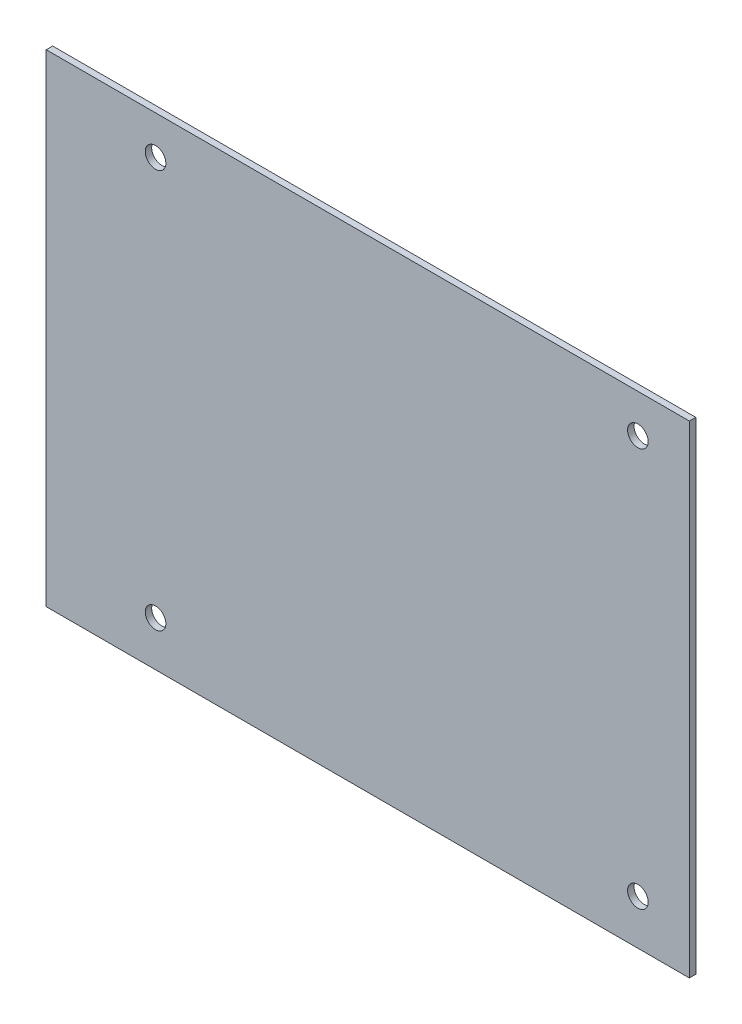
ISO-10303-21;
HEADER;
FILE_DESCRIPTION(('STEP AP214'),'2;1');
FILE_NAME('part.step','',(''),(''),'','','');
FILE_SCHEMA(('AUTOMOTIVE_DESIGN { 1 0 10303 214 1 1 1 1 }'));
ENDSEC;
DATA;
#1=APPLICATION_CONTEXT('core data for automotive mechanical design processes');
#2=APPLICATION_PROTOCOL_DEFINITION('international standard','automotive_design',2000,#1);
#3=PRODUCT_CONTEXT('',#1,'mechanical');
#4=PRODUCT('Part','Part','',(#3));
#5=PRODUCT_RELATED_PRODUCT_CATEGORY('part','',(#4));
#6=PRODUCT_DEFINITION_FORMATION('','',#4);
#7=PRODUCT_DEFINITION_CONTEXT('part definition',#1,'design');
#8=PRODUCT_DEFINITION('design','',#6,#7);
#9=PRODUCT_DEFINITION_SHAPE('','',#8);
#10=(LENGTH_UNIT() NAMED_UNIT(*) SI_UNIT(.MILLI.,.METRE.));
#11=(NAMED_UNIT(*) PLANE_ANGLE_UNIT() SI_UNIT($,.RADIAN.));
#12=(NAMED_UNIT(*) SI_UNIT($,.STERADIAN.) SOLID_ANGLE_UNIT());
#13=UNCERTAINTY_MEASURE_WITH_UNIT(LENGTH_MEASURE(1.E-05),#10,'distance_accuracy_value','');
#14=(GEOMETRIC_REPRESENTATION_CONTEXT(3) GLOBAL_UNCERTAINTY_ASSIGNED_CONTEXT((#13)) GLOBAL_UNIT_ASSIGNED_CONTEXT((#10,
#11,#12)) REPRESENTATION_CONTEXT('',''));
#15=CARTESIAN_POINT('',(0.,0.,0.));
#16=DIRECTION('',(0.,0.,1.));
#17=DIRECTION('',(1.,0.,0.));
#18=AXIS2_PLACEMENT_3D('',#15,#16,#17);
#19=CARTESIAN_POINT('',(-50.,37.5,1.));
#20=DIRECTION('',(1.,0.,0.));
#21=DIRECTION('',(0.,1.,0.));
#22=AXIS2_PLACEMENT_3D('',#19,#20,#21);
#23=PLANE('',#22);
#24=DIRECTION('',(0.,-1.,0.));
#25=VECTOR('',#24,1.);
#26=CARTESIAN_POINT('',(-50.,37.5,0.));
#27=LINE('',#26,#25);
#28=CARTESIAN_POINT('',(-50.,37.5,0.));
#29=VERTEX_POINT('',#28);
#30=CARTESIAN_POINT('',(-50.,-37.5,0.));
#31=VERTEX_POINT('',#30);
#32=EDGE_CURVE('E100',#29,#31,#27,.T.);
#33=ORIENTED_EDGE('',*,*,#32,.T.);
#34=DIRECTION('',(0.,0.,-1.));
#35=VECTOR('',#34,1.);
#36=CARTESIAN_POINT('',(-50.,-37.5,1.));
#37=LINE('',#36,#35);
#38=CARTESIAN_POINT('',(-50.,-37.5,1.));
#39=VERTEX_POINT('',#38);
#40=EDGE_CURVE('E91',#39,#31,#37,.T.);
#41=ORIENTED_EDGE('',*,*,#40,.F.);
#42=DIRECTION('',(0.,-1.,0.));
#43=VECTOR('',#42,1.);
#44=CARTESIAN_POINT('',(-50.,37.5,1.));
#45=LINE('',#44,#43);
#46=CARTESIAN_POINT('',(-50.,37.5,1.));
#47=VERTEX_POINT('',#46);
#48=EDGE_CURVE('E85',#47,#39,#45,.T.);
#49=ORIENTED_EDGE('',*,*,#48,.F.);
#50=DIRECTION('',(0.,0.,-1.));
#51=VECTOR('',#50,1.);
#52=CARTESIAN_POINT('',(-50.,37.5,1.));
#53=LINE('',#52,#51);
#54=EDGE_CURVE('E96',#47,#29,#53,.T.);
#55=ORIENTED_EDGE('',*,*,#54,.T.);
#56=EDGE_LOOP('',(#33,#41,#49,#55));
#57=FACE_BOUND('',#56,.T.);
#58=ADVANCED_FACE('F31',(#57),#23,.F.);
#59=CARTESIAN_POINT('',(-50.,-37.5,1.));
#60=DIRECTION('',(0.,1.,0.));
#61=DIRECTION('',(-1.,0.,0.));
#62=AXIS2_PLACEMENT_3D('',#59,#60,#61);
#63=PLANE('',#62);
#64=DIRECTION('',(1.,0.,0.));
#65=VECTOR('',#64,1.);
#66=CARTESIAN_POINT('',(-50.,-37.5,0.));
#67=LINE('',#66,#65);
#68=CARTESIAN_POINT('',(50.,-37.5,0.));
#69=VERTEX_POINT('',#68);
#70=EDGE_CURVE('E90',#31,#69,#67,.T.);
#71=ORIENTED_EDGE('',*,*,#70,.T.);
#72=DIRECTION('',(0.,0.,-1.));
#73=VECTOR('',#72,1.);
#74=CARTESIAN_POINT('',(50.,-37.5,1.));
#75=LINE('',#74,#73);
#76=CARTESIAN_POINT('',(50.,-37.5,1.));
#77=VERTEX_POINT('',#76);
#78=EDGE_CURVE('E88',#77,#69,#75,.T.);
#79=ORIENTED_EDGE('',*,*,#78,.F.);
#80=DIRECTION('',(1.,0.,0.));
#81=VECTOR('',#80,1.);
#82=CARTESIAN_POINT('',(-50.,-37.5,1.));
#83=LINE('',#82,#81);
#84=EDGE_CURVE('E79',#39,#77,#83,.T.);
#85=ORIENTED_EDGE('',*,*,#84,.F.);
#86=ORIENTED_EDGE('',*,*,#40,.T.);
#87=EDGE_LOOP('',(#71,#79,#85,#86));
#88=FACE_BOUND('',#87,.T.);
#89=ADVANCED_FACE('F89',(#88),#63,.F.);
#90=CARTESIAN_POINT('',(50.,37.5,1.));
#91=DIRECTION('',(-1.,0.,0.));
#92=DIRECTION('',(0.,-1.,0.));
#93=AXIS2_PLACEMENT_3D('',#90,#91,#92);
#94=PLANE('',#93);
#95=DIRECTION('',(0.,1.,0.));
#96=VECTOR('',#95,1.);
#97=CARTESIAN_POINT('',(50.,37.5,0.));
#98=LINE('',#97,#96);
#99=CARTESIAN_POINT('',(50.,37.5,0.));
#100=VERTEX_POINT('',#99);
#101=EDGE_CURVE('E65',#69,#100,#98,.T.);
#102=ORIENTED_EDGE('',*,*,#101,.T.);
#103=DIRECTION('',(0.,0.,-1.));
#104=VECTOR('',#103,1.);
#105=CARTESIAN_POINT('',(50.,37.5,1.));
#106=LINE('',#105,#104);
#107=CARTESIAN_POINT('',(50.,37.5,1.));
#108=VERTEX_POINT('',#107);
#109=EDGE_CURVE('E92',#108,#100,#106,.T.);
#110=ORIENTED_EDGE('',*,*,#109,.F.);
#111=DIRECTION('',(0.,1.,0.));
#112=VECTOR('',#111,1.);
#113=CARTESIAN_POINT('',(50.,37.5,1.));
#114=LINE('',#113,#112);
#115=EDGE_CURVE('E83',#77,#108,#114,.T.);
#116=ORIENTED_EDGE('',*,*,#115,.F.);
#117=ORIENTED_EDGE('',*,*,#78,.T.);
#118=EDGE_LOOP('',(#102,#110,#116,#117));
#119=FACE_BOUND('',#118,.T.);
#120=ADVANCED_FACE('F94',(#119),#94,.F.);
#121=CARTESIAN_POINT('',(-50.,37.5,1.));
#122=DIRECTION('',(0.,-1.,0.));
#123=DIRECTION('',(0.,0.,-1.));
#124=AXIS2_PLACEMENT_3D('',#121,#122,#123);
#125=PLANE('',#124);
#126=DIRECTION('',(-1.,0.,0.));
#127=VECTOR('',#126,1.);
#128=CARTESIAN_POINT('',(-50.,37.5,0.));
#129=LINE('',#128,#127);
#130=EDGE_CURVE('E71',#100,#29,#129,.T.);
#131=ORIENTED_EDGE('',*,*,#130,.T.);
#132=ORIENTED_EDGE('',*,*,#54,.F.);
#133=DIRECTION('',(-1.,0.,0.));
#134=VECTOR('',#133,1.);
#135=CARTESIAN_POINT('',(-50.,37.5,1.));
#136=LINE('',#135,#134);
#137=EDGE_CURVE('E48',#108,#47,#136,.T.);
#138=ORIENTED_EDGE('',*,*,#137,.F.);
#139=ORIENTED_EDGE('',*,*,#109,.T.);
#140=EDGE_LOOP('',(#131,#132,#138,#139));
#141=FACE_BOUND('',#140,.T.);
#142=ADVANCED_FACE('F126',(#141),#125,.F.);
#143=CARTESIAN_POINT('',(-50.,-37.5,1.));
#144=DIRECTION('',(0.,0.,1.));
#145=DIRECTION('',(1.,0.,0.));
#146=AXIS2_PLACEMENT_3D('',#143,#144,#145);
#147=PLANE('',#146);
#148=CARTESIAN_POINT('',(-33.,-30.5,1.));
#149=DIRECTION('',(0.,0.,1.));
#150=DIRECTION('',(1.,0.,0.));
#151=AXIS2_PLACEMENT_3D('',#148,#149,#150);
#152=CIRCLE('',#151,1.6);
#153=CARTESIAN_POINT('',(-31.4,-30.5,1.));
#154=VERTEX_POINT('',#153);
#155=EDGE_CURVE('E169',#154,#154,#152,.T.);
#156=ORIENTED_EDGE('',*,*,#155,.F.);
#157=EDGE_LOOP('',(#156));
#158=FACE_BOUND('',#157,.T.);
#159=CARTESIAN_POINT('',(42.,-30.5,1.));
#160=DIRECTION('',(0.,0.,1.));
#161=DIRECTION('',(1.,0.,0.));
#162=AXIS2_PLACEMENT_3D('',#159,#160,#161);
#163=CIRCLE('',#162,1.6);
#164=CARTESIAN_POINT('',(43.6,-30.5,1.));
#165=VERTEX_POINT('',#164);
#166=EDGE_CURVE('E170',#165,#165,#163,.T.);
#167=ORIENTED_EDGE('',*,*,#166,.F.);
#168=EDGE_LOOP('',(#167));
#169=FACE_BOUND('',#168,.T.);
#170=ORIENTED_EDGE('',*,*,#48,.T.);
#171=ORIENTED_EDGE('',*,*,#84,.T.);
#172=ORIENTED_EDGE('',*,*,#115,.T.);
#173=ORIENTED_EDGE('',*,*,#137,.T.);
#174=EDGE_LOOP('',(#170,#171,#172,#173));
#175=FACE_BOUND('',#174,.T.);
#176=CARTESIAN_POINT('',(42.,31.5,1.));
#177=DIRECTION('',(0.,0.,1.));
#178=DIRECTION('',(1.,0.,0.));
#179=AXIS2_PLACEMENT_3D('',#176,#177,#178);
#180=CIRCLE('',#179,1.6);
#181=CARTESIAN_POINT('',(43.6,31.5,1.));
#182=VERTEX_POINT('',#181);
#183=EDGE_CURVE('E113',#182,#182,#180,.T.);
#184=ORIENTED_EDGE('',*,*,#183,.F.);
#185=EDGE_LOOP('',(#184));
#186=FACE_BOUND('',#185,.T.);
#187=CARTESIAN_POINT('',(-33.,31.5,1.));
#188=DIRECTION('',(0.,0.,1.));
#189=DIRECTION('',(1.,0.,0.));
#190=AXIS2_PLACEMENT_3D('',#187,#188,#189);
#191=CIRCLE('',#190,1.6);
#192=CARTESIAN_POINT('',(-31.4,31.5,1.));
#193=VERTEX_POINT('',#192);
#194=EDGE_CURVE('E11',#193,#193,#191,.T.);
#195=ORIENTED_EDGE('',*,*,#194,.F.);
#196=EDGE_LOOP('',(#195));
#197=FACE_BOUND('',#196,.T.);
#198=ADVANCED_FACE('F80',(#158,#169,#175,#186,#197),#147,.T.);
#199=CARTESIAN_POINT('',(-50.,-37.5,0.));
#200=DIRECTION('',(0.,0.,1.));
#201=DIRECTION('',(1.,0.,0.));
#202=AXIS2_PLACEMENT_3D('',#199,#200,#201);
#203=PLANE('',#202);
#204=CARTESIAN_POINT('',(-33.,-30.5,0.));
#205=DIRECTION('',(0.,0.,1.));
#206=DIRECTION('',(1.,0.,0.));
#207=AXIS2_PLACEMENT_3D('',#204,#205,#206);
#208=CIRCLE('',#207,1.6);
#209=CARTESIAN_POINT('',(-31.4,-30.5,0.));
#210=VERTEX_POINT('',#209);
#211=EDGE_CURVE('E167',#210,#210,#208,.T.);
#212=ORIENTED_EDGE('',*,*,#211,.T.);
#213=EDGE_LOOP('',(#212));
#214=FACE_BOUND('',#213,.T.);
#215=CARTESIAN_POINT('',(42.,-30.5,0.));
#216=DIRECTION('',(0.,0.,1.));
#217=DIRECTION('',(1.,0.,0.));
#218=AXIS2_PLACEMENT_3D('',#215,#216,#217);
#219=CIRCLE('',#218,1.6);
#220=CARTESIAN_POINT('',(43.6,-30.5,0.));
#221=VERTEX_POINT('',#220);
#222=EDGE_CURVE('E103',#221,#221,#219,.T.);
#223=ORIENTED_EDGE('',*,*,#222,.T.);
#224=EDGE_LOOP('',(#223));
#225=FACE_BOUND('',#224,.T.);
#226=ORIENTED_EDGE('',*,*,#32,.F.);
#227=ORIENTED_EDGE('',*,*,#130,.F.);
#228=ORIENTED_EDGE('',*,*,#101,.F.);
#229=ORIENTED_EDGE('',*,*,#70,.F.);
#230=EDGE_LOOP('',(#226,#227,#228,#229));
#231=FACE_BOUND('',#230,.T.);
#232=CARTESIAN_POINT('',(42.,31.5,0.));
#233=DIRECTION('',(0.,0.,1.));
#234=DIRECTION('',(1.,0.,0.));
#235=AXIS2_PLACEMENT_3D('',#232,#233,#234);
#236=CIRCLE('',#235,1.6);
#237=CARTESIAN_POINT('',(43.6,31.5,0.));
#238=VERTEX_POINT('',#237);
#239=EDGE_CURVE('E110',#238,#238,#236,.T.);
#240=ORIENTED_EDGE('',*,*,#239,.T.);
#241=EDGE_LOOP('',(#240));
#242=FACE_BOUND('',#241,.T.);
#243=CARTESIAN_POINT('',(-33.,31.5,0.));
#244=DIRECTION('',(0.,0.,1.));
#245=DIRECTION('',(1.,0.,0.));
#246=AXIS2_PLACEMENT_3D('',#243,#244,#245);
#247=CIRCLE('',#246,1.6);
#248=CARTESIAN_POINT('',(-31.4,31.5,0.));
#249=VERTEX_POINT('',#248);
#250=EDGE_CURVE('E40',#249,#249,#247,.T.);
#251=ORIENTED_EDGE('',*,*,#250,.T.);
#252=EDGE_LOOP('',(#251));
#253=FACE_BOUND('',#252,.T.);
#254=ADVANCED_FACE('F118',(#214,#225,#231,#242,#253),#203,.F.);
#255=CARTESIAN_POINT('',(42.,-30.5,0.));
#256=DIRECTION('',(0.,0.,1.));
#257=DIRECTION('',(1.,0.,0.));
#258=AXIS2_PLACEMENT_3D('',#255,#256,#257);
#259=CYLINDRICAL_SURFACE('',#258,1.6);
#260=ORIENTED_EDGE('',*,*,#222,.F.);
#261=EDGE_LOOP('',(#260));
#262=FACE_BOUND('',#261,.T.);
#263=ORIENTED_EDGE('',*,*,#166,.T.);
#264=EDGE_LOOP('',(#263));
#265=FACE_BOUND('',#264,.T.);
#266=ADVANCED_FACE('F133',(#262,#265),#259,.F.);
#267=CARTESIAN_POINT('',(-33.,-30.5,0.));
#268=DIRECTION('',(0.,0.,1.));
#269=DIRECTION('',(1.,0.,0.));
#270=AXIS2_PLACEMENT_3D('',#267,#268,#269);
#271=CYLINDRICAL_SURFACE('',#270,1.6);
#272=ORIENTED_EDGE('',*,*,#211,.F.);
#273=EDGE_LOOP('',(#272));
#274=FACE_BOUND('',#273,.T.);
#275=ORIENTED_EDGE('',*,*,#155,.T.);
#276=EDGE_LOOP('',(#275));
#277=FACE_BOUND('',#276,.T.);
#278=ADVANCED_FACE('F149',(#274,#277),#271,.F.);
#279=CARTESIAN_POINT('',(42.,31.5,0.));
#280=DIRECTION('',(0.,0.,1.));
#281=DIRECTION('',(1.,0.,0.));
#282=AXIS2_PLACEMENT_3D('',#279,#280,#281);
#283=CYLINDRICAL_SURFACE('',#282,1.6);
#284=ORIENTED_EDGE('',*,*,#239,.F.);
#285=EDGE_LOOP('',(#284));
#286=FACE_BOUND('',#285,.T.);
#287=ORIENTED_EDGE('',*,*,#183,.T.);
#288=EDGE_LOOP('',(#287));
#289=FACE_BOUND('',#288,.T.);
#290=ADVANCED_FACE('F122',(#286,#289),#283,.F.);
#291=CARTESIAN_POINT('',(-33.,31.5,0.));
#292=DIRECTION('',(0.,0.,1.));
#293=DIRECTION('',(1.,0.,0.));
#294=AXIS2_PLACEMENT_3D('',#291,#292,#293);
#295=CYLINDRICAL_SURFACE('',#294,1.6);
#296=ORIENTED_EDGE('',*,*,#250,.F.);
#297=EDGE_LOOP('',(#296));
#298=FACE_BOUND('',#297,.T.);
#299=ORIENTED_EDGE('',*,*,#194,.T.);
#300=EDGE_LOOP('',(#299));
#301=FACE_BOUND('',#300,.T.);
#302=ADVANCED_FACE('F33',(#298,#301),#295,.F.);
#303=CLOSED_SHELL('',(#58,#89,#120,#142,#198,#254,#266,#278,#290,#302));
#304=MANIFOLD_SOLID_BREP('B2',#303);
#305=ADVANCED_BREP_SHAPE_REPRESENTATION('',(#18,#304),#14);
#306=SHAPE_DEFINITION_REPRESENTATION(#9,#305);
ENDSEC;
END-ISO-10303-21;
